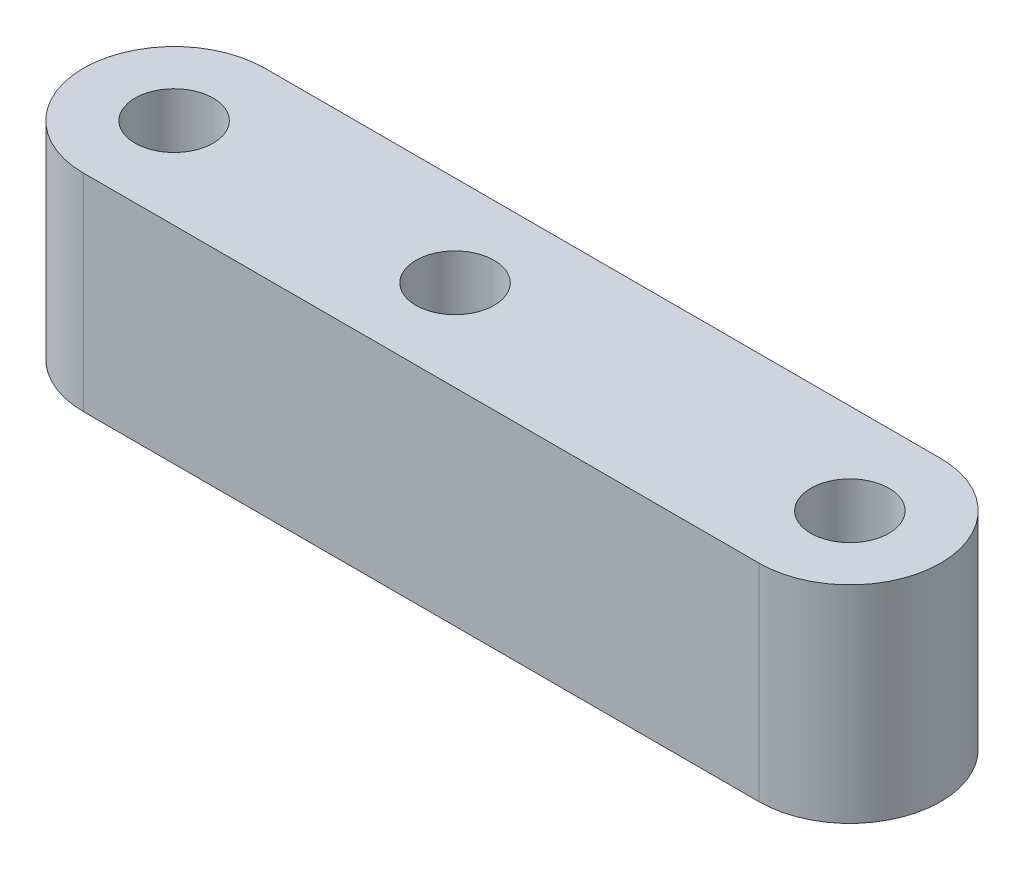
ISO-10303-21;
HEADER;
FILE_DESCRIPTION(('STEP AP214'),'2;1');
FILE_NAME('part.step','',(''),(''),'','','');
FILE_SCHEMA(('AUTOMOTIVE_DESIGN { 1 0 10303 214 1 1 1 1 }'));
ENDSEC;
DATA;
#1=APPLICATION_CONTEXT('core data for automotive mechanical design processes');
#2=APPLICATION_PROTOCOL_DEFINITION('international standard','automotive_design',2000,#1);
#3=PRODUCT_CONTEXT('',#1,'mechanical');
#4=PRODUCT('Part','Part','',(#3));
#5=PRODUCT_RELATED_PRODUCT_CATEGORY('part','',(#4));
#6=PRODUCT_DEFINITION_FORMATION('','',#4);
#7=PRODUCT_DEFINITION_CONTEXT('part definition',#1,'design');
#8=PRODUCT_DEFINITION('design','',#6,#7);
#9=PRODUCT_DEFINITION_SHAPE('','',#8);
#10=(LENGTH_UNIT() NAMED_UNIT(*) SI_UNIT(.MILLI.,.METRE.));
#11=(NAMED_UNIT(*) PLANE_ANGLE_UNIT() SI_UNIT($,.RADIAN.));
#12=(NAMED_UNIT(*) SI_UNIT($,.STERADIAN.) SOLID_ANGLE_UNIT());
#13=UNCERTAINTY_MEASURE_WITH_UNIT(LENGTH_MEASURE(1.E-05),#10,'distance_accuracy_value','');
#14=(GEOMETRIC_REPRESENTATION_CONTEXT(3) GLOBAL_UNCERTAINTY_ASSIGNED_CONTEXT((#13)) GLOBAL_UNIT_ASSIGNED_CONTEXT((#10,
#11,#12)) REPRESENTATION_CONTEXT('',''));
#15=CARTESIAN_POINT('',(0.,0.,0.));
#16=DIRECTION('',(0.,0.,1.));
#17=DIRECTION('',(1.,0.,0.));
#18=AXIS2_PLACEMENT_3D('',#15,#16,#17);
#19=CARTESIAN_POINT('',(0.,9.398,0.));
#20=DIRECTION('',(0.,1.,0.));
#21=DIRECTION('',(0.,0.,1.));
#22=AXIS2_PLACEMENT_3D('',#19,#20,#21);
#23=PLANE('',#22);
#24=CARTESIAN_POINT('',(25.5524,9.398,0.));
#25=DIRECTION('',(0.,1.,0.));
#26=DIRECTION('',(0.,0.,1.));
#27=AXIS2_PLACEMENT_3D('',#24,#25,#26);
#28=CIRCLE('',#27,3.556);
#29=CARTESIAN_POINT('',(25.5524,9.398,3.556));
#30=VERTEX_POINT('',#29);
#31=EDGE_CURVE('E119',#30,#30,#28,.T.);
#32=ORIENTED_EDGE('',*,*,#31,.F.);
#33=EDGE_LOOP('',(#32));
#34=FACE_BOUND('',#33,.T.);
#35=CARTESIAN_POINT('',(0.,9.398,0.));
#36=DIRECTION('',(0.,1.,0.));
#37=DIRECTION('',(0.,0.,1.));
#38=AXIS2_PLACEMENT_3D('',#35,#36,#37);
#39=CIRCLE('',#38,8.255);
#40=CARTESIAN_POINT('',(0.,9.398,-8.255));
#41=VERTEX_POINT('',#40);
#42=CARTESIAN_POINT('',(0.,9.398,8.255));
#43=VERTEX_POINT('',#42);
#44=EDGE_CURVE('E89',#41,#43,#39,.T.);
#45=ORIENTED_EDGE('',*,*,#44,.T.);
#46=DIRECTION('',(1.,0.,0.));
#47=VECTOR('',#46,1.);
#48=CARTESIAN_POINT('',(0.,9.398,8.255));
#49=LINE('',#48,#47);
#50=CARTESIAN_POINT('',(61.468,9.398,8.255));
#51=VERTEX_POINT('',#50);
#52=EDGE_CURVE('E84',#43,#51,#49,.T.);
#53=ORIENTED_EDGE('',*,*,#52,.T.);
#54=CARTESIAN_POINT('',(61.468,9.398,0.));
#55=DIRECTION('',(0.,1.,0.));
#56=DIRECTION('',(0.,0.,1.));
#57=AXIS2_PLACEMENT_3D('',#54,#55,#56);
#58=CIRCLE('',#57,8.255);
#59=CARTESIAN_POINT('',(61.468,9.398,-8.255));
#60=VERTEX_POINT('',#59);
#61=EDGE_CURVE('E87',#51,#60,#58,.T.);
#62=ORIENTED_EDGE('',*,*,#61,.T.);
#63=DIRECTION('',(-1.,0.,0.));
#64=VECTOR('',#63,1.);
#65=CARTESIAN_POINT('',(0.,9.398,-8.255));
#66=LINE('',#65,#64);
#67=EDGE_CURVE('E54',#60,#41,#66,.T.);
#68=ORIENTED_EDGE('',*,*,#67,.T.);
#69=EDGE_LOOP('',(#45,#53,#62,#68));
#70=FACE_BOUND('',#69,.T.);
#71=CARTESIAN_POINT('',(0.,9.398,0.));
#72=DIRECTION('',(0.,1.,0.));
#73=DIRECTION('',(0.,0.,1.));
#74=AXIS2_PLACEMENT_3D('',#71,#72,#73);
#75=CIRCLE('',#74,3.556);
#76=CARTESIAN_POINT('',(0.,9.398,3.556));
#77=VERTEX_POINT('',#76);
#78=EDGE_CURVE('E104',#77,#77,#75,.T.);
#79=ORIENTED_EDGE('',*,*,#78,.F.);
#80=EDGE_LOOP('',(#79));
#81=FACE_BOUND('',#80,.T.);
#82=CARTESIAN_POINT('',(61.468,9.398,0.));
#83=DIRECTION('',(0.,1.,0.));
#84=DIRECTION('',(0.,0.,1.));
#85=AXIS2_PLACEMENT_3D('',#82,#83,#84);
#86=CIRCLE('',#85,3.556);
#87=CARTESIAN_POINT('',(61.468,9.398,3.556));
#88=VERTEX_POINT('',#87);
#89=EDGE_CURVE('E125',#88,#88,#86,.T.);
#90=ORIENTED_EDGE('',*,*,#89,.F.);
#91=EDGE_LOOP('',(#90));
#92=FACE_BOUND('',#91,.T.);
#93=ADVANCED_FACE('F37',(#34,#70,#81,#92),#23,.T.);
#94=CARTESIAN_POINT('',(0.,-9.398,0.));
#95=DIRECTION('',(0.,1.,0.));
#96=DIRECTION('',(0.,0.,1.));
#97=AXIS2_PLACEMENT_3D('',#94,#95,#96);
#98=PLANE('',#97);
#99=CARTESIAN_POINT('',(0.,-9.398,0.));
#100=DIRECTION('',(0.,1.,0.));
#101=DIRECTION('',(0.,0.,1.));
#102=AXIS2_PLACEMENT_3D('',#99,#100,#101);
#103=CIRCLE('',#102,8.255);
#104=CARTESIAN_POINT('',(0.,-9.398,-8.255));
#105=VERTEX_POINT('',#104);
#106=CARTESIAN_POINT('',(0.,-9.398,8.255));
#107=VERTEX_POINT('',#106);
#108=EDGE_CURVE('E101',#105,#107,#103,.T.);
#109=ORIENTED_EDGE('',*,*,#108,.F.);
#110=DIRECTION('',(-1.,0.,0.));
#111=VECTOR('',#110,1.);
#112=CARTESIAN_POINT('',(0.,-9.398,-8.255));
#113=LINE('',#112,#111);
#114=CARTESIAN_POINT('',(61.468,-9.398,-8.255));
#115=VERTEX_POINT('',#114);
#116=EDGE_CURVE('E77',#115,#105,#113,.T.);
#117=ORIENTED_EDGE('',*,*,#116,.F.);
#118=CARTESIAN_POINT('',(61.468,-9.398,0.));
#119=DIRECTION('',(0.,1.,0.));
#120=DIRECTION('',(0.,0.,1.));
#121=AXIS2_PLACEMENT_3D('',#118,#119,#120);
#122=CIRCLE('',#121,8.255);
#123=CARTESIAN_POINT('',(61.468,-9.398,8.255));
#124=VERTEX_POINT('',#123);
#125=EDGE_CURVE('E71',#124,#115,#122,.T.);
#126=ORIENTED_EDGE('',*,*,#125,.F.);
#127=DIRECTION('',(1.,0.,0.));
#128=VECTOR('',#127,1.);
#129=CARTESIAN_POINT('',(0.,-9.398,8.255));
#130=LINE('',#129,#128);
#131=EDGE_CURVE('E93',#107,#124,#130,.T.);
#132=ORIENTED_EDGE('',*,*,#131,.F.);
#133=EDGE_LOOP('',(#109,#117,#126,#132));
#134=FACE_BOUND('',#133,.T.);
#135=CARTESIAN_POINT('',(0.,-9.398,0.));
#136=DIRECTION('',(0.,1.,0.));
#137=DIRECTION('',(0.,0.,1.));
#138=AXIS2_PLACEMENT_3D('',#135,#136,#137);
#139=CIRCLE('',#138,3.556);
#140=CARTESIAN_POINT('',(0.,-9.398,3.556));
#141=VERTEX_POINT('',#140);
#142=EDGE_CURVE('E116',#141,#141,#139,.T.);
#143=ORIENTED_EDGE('',*,*,#142,.T.);
#144=EDGE_LOOP('',(#143));
#145=FACE_BOUND('',#144,.T.);
#146=CARTESIAN_POINT('',(25.5524,-9.398,0.));
#147=DIRECTION('',(0.,1.,0.));
#148=DIRECTION('',(0.,0.,1.));
#149=AXIS2_PLACEMENT_3D('',#146,#147,#148);
#150=CIRCLE('',#149,3.556);
#151=CARTESIAN_POINT('',(25.5524,-9.398,3.556));
#152=VERTEX_POINT('',#151);
#153=EDGE_CURVE('E122',#152,#152,#150,.T.);
#154=ORIENTED_EDGE('',*,*,#153,.T.);
#155=EDGE_LOOP('',(#154));
#156=FACE_BOUND('',#155,.T.);
#157=CARTESIAN_POINT('',(61.468,-9.398,0.));
#158=DIRECTION('',(0.,1.,0.));
#159=DIRECTION('',(0.,0.,1.));
#160=AXIS2_PLACEMENT_3D('',#157,#158,#159);
#161=CIRCLE('',#160,3.556);
#162=CARTESIAN_POINT('',(61.468,-9.398,3.556));
#163=VERTEX_POINT('',#162);
#164=EDGE_CURVE('E128',#163,#163,#161,.T.);
#165=ORIENTED_EDGE('',*,*,#164,.T.);
#166=EDGE_LOOP('',(#165));
#167=FACE_BOUND('',#166,.T.);
#168=ADVANCED_FACE('F112',(#134,#145,#156,#167),#98,.F.);
#169=CARTESIAN_POINT('',(0.,9.398,0.));
#170=DIRECTION('',(0.,-1.,0.));
#171=DIRECTION('',(0.,0.,-1.));
#172=AXIS2_PLACEMENT_3D('',#169,#170,#171);
#173=CYLINDRICAL_SURFACE('',#172,8.255);
#174=ORIENTED_EDGE('',*,*,#108,.T.);
#175=DIRECTION('',(0.,-1.,0.));
#176=VECTOR('',#175,1.);
#177=CARTESIAN_POINT('',(0.,9.398,8.255));
#178=LINE('',#177,#176);
#179=EDGE_CURVE('E11',#43,#107,#178,.T.);
#180=ORIENTED_EDGE('',*,*,#179,.F.);
#181=ORIENTED_EDGE('',*,*,#44,.F.);
#182=DIRECTION('',(0.,-1.,0.));
#183=VECTOR('',#182,1.);
#184=CARTESIAN_POINT('',(0.,9.398,-8.255));
#185=LINE('',#184,#183);
#186=EDGE_CURVE('E97',#41,#105,#185,.T.);
#187=ORIENTED_EDGE('',*,*,#186,.T.);
#188=EDGE_LOOP('',(#174,#180,#181,#187));
#189=FACE_BOUND('',#188,.T.);
#190=ADVANCED_FACE('F39',(#189),#173,.T.);
#191=CARTESIAN_POINT('',(0.,9.398,8.255));
#192=DIRECTION('',(0.,0.,-1.));
#193=DIRECTION('',(-1.,0.,0.));
#194=AXIS2_PLACEMENT_3D('',#191,#192,#193);
#195=PLANE('',#194);
#196=ORIENTED_EDGE('',*,*,#131,.T.);
#197=DIRECTION('',(0.,-1.,0.));
#198=VECTOR('',#197,1.);
#199=CARTESIAN_POINT('',(61.468,9.398,8.255));
#200=LINE('',#199,#198);
#201=EDGE_CURVE('E46',#51,#124,#200,.T.);
#202=ORIENTED_EDGE('',*,*,#201,.F.);
#203=ORIENTED_EDGE('',*,*,#52,.F.);
#204=ORIENTED_EDGE('',*,*,#179,.T.);
#205=EDGE_LOOP('',(#196,#202,#203,#204));
#206=FACE_BOUND('',#205,.T.);
#207=ADVANCED_FACE('F92',(#206),#195,.F.);
#208=CARTESIAN_POINT('',(61.468,9.398,0.));
#209=DIRECTION('',(0.,-1.,0.));
#210=DIRECTION('',(0.,0.,-1.));
#211=AXIS2_PLACEMENT_3D('',#208,#209,#210);
#212=CYLINDRICAL_SURFACE('',#211,8.255);
#213=ORIENTED_EDGE('',*,*,#125,.T.);
#214=DIRECTION('',(0.,-1.,0.));
#215=VECTOR('',#214,1.);
#216=CARTESIAN_POINT('',(61.468,9.398,-8.255));
#217=LINE('',#216,#215);
#218=EDGE_CURVE('E94',#60,#115,#217,.T.);
#219=ORIENTED_EDGE('',*,*,#218,.F.);
#220=ORIENTED_EDGE('',*,*,#61,.F.);
#221=ORIENTED_EDGE('',*,*,#201,.T.);
#222=EDGE_LOOP('',(#213,#219,#220,#221));
#223=FACE_BOUND('',#222,.T.);
#224=ADVANCED_FACE('F95',(#223),#212,.T.);
#225=CARTESIAN_POINT('',(0.,9.398,-8.255));
#226=DIRECTION('',(0.,0.,1.));
#227=DIRECTION('',(1.,0.,0.));
#228=AXIS2_PLACEMENT_3D('',#225,#226,#227);
#229=PLANE('',#228);
#230=ORIENTED_EDGE('',*,*,#116,.T.);
#231=ORIENTED_EDGE('',*,*,#186,.F.);
#232=ORIENTED_EDGE('',*,*,#67,.F.);
#233=ORIENTED_EDGE('',*,*,#218,.T.);
#234=EDGE_LOOP('',(#230,#231,#232,#233));
#235=FACE_BOUND('',#234,.T.);
#236=ADVANCED_FACE('F109',(#235),#229,.F.);
#237=CARTESIAN_POINT('',(0.,9.398,0.));
#238=DIRECTION('',(0.,-1.,0.));
#239=DIRECTION('',(0.,0.,-1.));
#240=AXIS2_PLACEMENT_3D('',#237,#238,#239);
#241=CYLINDRICAL_SURFACE('',#240,3.556);
#242=ORIENTED_EDGE('',*,*,#78,.T.);
#243=EDGE_LOOP('',(#242));
#244=FACE_BOUND('',#243,.T.);
#245=ORIENTED_EDGE('',*,*,#142,.F.);
#246=EDGE_LOOP('',(#245));
#247=FACE_BOUND('',#246,.T.);
#248=ADVANCED_FACE('F146',(#244,#247),#241,.F.);
#249=CARTESIAN_POINT('',(25.5524,9.398,0.));
#250=DIRECTION('',(0.,-1.,0.));
#251=DIRECTION('',(0.,0.,-1.));
#252=AXIS2_PLACEMENT_3D('',#249,#250,#251);
#253=CYLINDRICAL_SURFACE('',#252,3.556);
#254=ORIENTED_EDGE('',*,*,#31,.T.);
#255=EDGE_LOOP('',(#254));
#256=FACE_BOUND('',#255,.T.);
#257=ORIENTED_EDGE('',*,*,#153,.F.);
#258=EDGE_LOOP('',(#257));
#259=FACE_BOUND('',#258,.T.);
#260=ADVANCED_FACE('F192',(#256,#259),#253,.F.);
#261=CARTESIAN_POINT('',(61.468,9.398,0.));
#262=DIRECTION('',(0.,-1.,0.));
#263=DIRECTION('',(0.,0.,-1.));
#264=AXIS2_PLACEMENT_3D('',#261,#262,#263);
#265=CYLINDRICAL_SURFACE('',#264,3.556);
#266=ORIENTED_EDGE('',*,*,#89,.T.);
#267=EDGE_LOOP('',(#266));
#268=FACE_BOUND('',#267,.T.);
#269=ORIENTED_EDGE('',*,*,#164,.F.);
#270=EDGE_LOOP('',(#269));
#271=FACE_BOUND('',#270,.T.);
#272=ADVANCED_FACE('F134',(#268,#271),#265,.F.);
#273=CLOSED_SHELL('',(#93,#168,#190,#207,#224,#236,#248,#260,#272));
#274=MANIFOLD_SOLID_BREP('B2',#273);
#275=ADVANCED_BREP_SHAPE_REPRESENTATION('',(#18,#274),#14);
#276=SHAPE_DEFINITION_REPRESENTATION(#9,#275);
ENDSEC;
END-ISO-10303-21;
